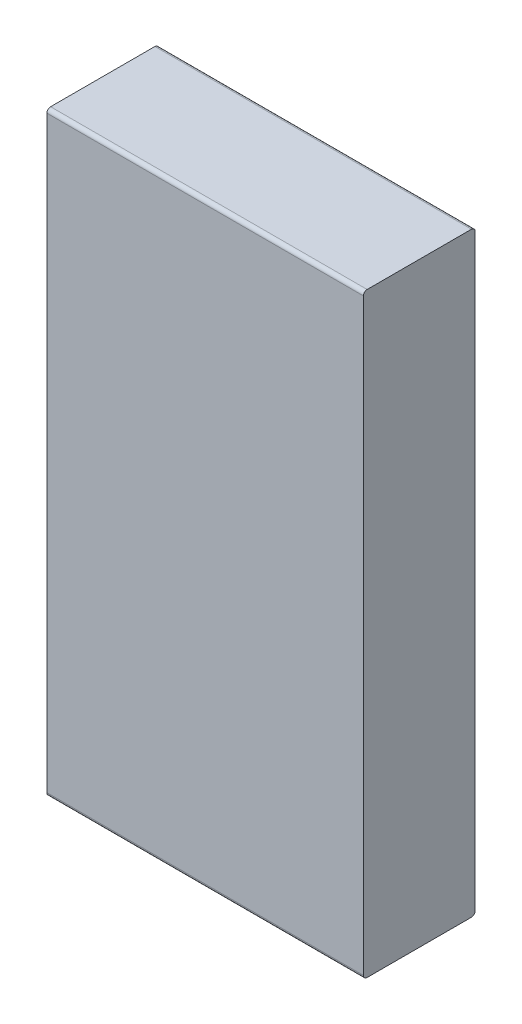
ISO-10303-21;
HEADER;
FILE_DESCRIPTION(('STEP AP214'),'2;1');
FILE_NAME('part.step','',(''),(''),'','','');
FILE_SCHEMA(('AUTOMOTIVE_DESIGN { 1 0 10303 214 1 1 1 1 }'));
ENDSEC;
DATA;
#1=APPLICATION_CONTEXT('core data for automotive mechanical design processes');
#2=APPLICATION_PROTOCOL_DEFINITION('international standard','automotive_design',2000,#1);
#3=PRODUCT_CONTEXT('',#1,'mechanical');
#4=PRODUCT('Part','Part','',(#3));
#5=PRODUCT_RELATED_PRODUCT_CATEGORY('part','',(#4));
#6=PRODUCT_DEFINITION_FORMATION('','',#4);
#7=PRODUCT_DEFINITION_CONTEXT('part definition',#1,'design');
#8=PRODUCT_DEFINITION('design','',#6,#7);
#9=PRODUCT_DEFINITION_SHAPE('','',#8);
#10=(LENGTH_UNIT() NAMED_UNIT(*) SI_UNIT(.MILLI.,.METRE.));
#11=(NAMED_UNIT(*) PLANE_ANGLE_UNIT() SI_UNIT($,.RADIAN.));
#12=(NAMED_UNIT(*) SI_UNIT($,.STERADIAN.) SOLID_ANGLE_UNIT());
#13=UNCERTAINTY_MEASURE_WITH_UNIT(LENGTH_MEASURE(1.E-05),#10,'distance_accuracy_value','');
#14=(GEOMETRIC_REPRESENTATION_CONTEXT(3) GLOBAL_UNCERTAINTY_ASSIGNED_CONTEXT((#13)) GLOBAL_UNIT_ASSIGNED_CONTEXT((#10,
#11,#12)) REPRESENTATION_CONTEXT('',''));
#15=CARTESIAN_POINT('',(0.,0.,0.));
#16=DIRECTION('',(0.,0.,1.));
#17=DIRECTION('',(1.,0.,0.));
#18=AXIS2_PLACEMENT_3D('',#15,#16,#17);
#19=CARTESIAN_POINT('',(0.425,-0.8,0.));
#20=DIRECTION('',(-1.,0.,0.));
#21=DIRECTION('',(0.,0.,1.));
#22=AXIS2_PLACEMENT_3D('',#19,#20,#21);
#23=PLANE('',#22);
#24=DIRECTION('',(0.,0.,1.));
#25=VECTOR('',#24,1.);
#26=CARTESIAN_POINT('',(0.425,-0.8,0.));
#27=LINE('',#26,#25);
#28=CARTESIAN_POINT('',(0.425,-0.8,0.01));
#29=VERTEX_POINT('',#28);
#30=CARTESIAN_POINT('',(0.425,-0.8,0.29));
#31=VERTEX_POINT('',#30);
#32=EDGE_CURVE('E11',#29,#31,#27,.T.);
#33=ORIENTED_EDGE('',*,*,#32,.F.);
#34=CARTESIAN_POINT('',(0.425,-0.79,0.01));
#35=DIRECTION('',(1.,0.,0.));
#36=DIRECTION('',(0.,0.,1.));
#37=AXIS2_PLACEMENT_3D('',#34,#35,#36);
#38=CIRCLE('',#37,0.01);
#39=CARTESIAN_POINT('',(0.425,-0.79,0.));
#40=VERTEX_POINT('',#39);
#41=EDGE_CURVE('E98',#29,#40,#38,.T.);
#42=ORIENTED_EDGE('',*,*,#41,.T.);
#43=DIRECTION('',(0.,1.,0.));
#44=VECTOR('',#43,1.);
#45=CARTESIAN_POINT('',(0.425,-0.8,0.));
#46=LINE('',#45,#44);
#47=CARTESIAN_POINT('',(0.425,0.79,0.));
#48=VERTEX_POINT('',#47);
#49=EDGE_CURVE('E101',#40,#48,#46,.T.);
#50=ORIENTED_EDGE('',*,*,#49,.T.);
#51=CARTESIAN_POINT('',(0.425,0.79,0.01));
#52=DIRECTION('',(-1.,0.,0.));
#53=DIRECTION('',(0.,0.,-1.));
#54=AXIS2_PLACEMENT_3D('',#51,#52,#53);
#55=CIRCLE('',#54,0.01);
#56=CARTESIAN_POINT('',(0.425,0.8,0.01));
#57=VERTEX_POINT('',#56);
#58=EDGE_CURVE('E154',#57,#48,#55,.T.);
#59=ORIENTED_EDGE('',*,*,#58,.F.);
#60=DIRECTION('',(0.,0.,1.));
#61=VECTOR('',#60,1.);
#62=CARTESIAN_POINT('',(0.425,0.8,0.));
#63=LINE('',#62,#61);
#64=CARTESIAN_POINT('',(0.425,0.8,0.29));
#65=VERTEX_POINT('',#64);
#66=EDGE_CURVE('E147',#57,#65,#63,.T.);
#67=ORIENTED_EDGE('',*,*,#66,.T.);
#68=CARTESIAN_POINT('',(0.425,0.79,0.29));
#69=DIRECTION('',(1.,0.,0.));
#70=DIRECTION('',(0.,0.,-1.));
#71=AXIS2_PLACEMENT_3D('',#68,#69,#70);
#72=CIRCLE('',#71,0.01);
#73=CARTESIAN_POINT('',(0.425,0.79,0.3));
#74=VERTEX_POINT('',#73);
#75=EDGE_CURVE('E129',#65,#74,#72,.T.);
#76=ORIENTED_EDGE('',*,*,#75,.T.);
#77=DIRECTION('',(0.,1.,0.));
#78=VECTOR('',#77,1.);
#79=CARTESIAN_POINT('',(0.425,-0.8,0.3));
#80=LINE('',#79,#78);
#81=CARTESIAN_POINT('',(0.425,-0.79,0.3));
#82=VERTEX_POINT('',#81);
#83=EDGE_CURVE('E106',#82,#74,#80,.T.);
#84=ORIENTED_EDGE('',*,*,#83,.F.);
#85=CARTESIAN_POINT('',(0.425,-0.79,0.29));
#86=DIRECTION('',(-1.,0.,0.));
#87=DIRECTION('',(0.,0.,1.));
#88=AXIS2_PLACEMENT_3D('',#85,#86,#87);
#89=CIRCLE('',#88,0.01);
#90=EDGE_CURVE('E26',#31,#82,#89,.T.);
#91=ORIENTED_EDGE('',*,*,#90,.F.);
#92=EDGE_LOOP('',(#33,#42,#50,#59,#67,#76,#84,#91));
#93=FACE_BOUND('',#92,.T.);
#94=ADVANCED_FACE('F17',(#93),#23,.F.);
#95=CARTESIAN_POINT('',(-0.425,-0.8,0.));
#96=DIRECTION('',(0.,1.,0.));
#97=DIRECTION('',(1.,0.,0.));
#98=AXIS2_PLACEMENT_3D('',#95,#96,#97);
#99=PLANE('',#98);
#100=DIRECTION('',(0.,0.,1.));
#101=VECTOR('',#100,1.);
#102=CARTESIAN_POINT('',(-0.425,-0.8,0.));
#103=LINE('',#102,#101);
#104=CARTESIAN_POINT('',(-0.425,-0.8,0.01));
#105=VERTEX_POINT('',#104);
#106=CARTESIAN_POINT('',(-0.425,-0.8,0.29));
#107=VERTEX_POINT('',#106);
#108=EDGE_CURVE('E135',#105,#107,#103,.T.);
#109=ORIENTED_EDGE('',*,*,#108,.F.);
#110=DIRECTION('',(1.,0.,0.));
#111=VECTOR('',#110,1.);
#112=CARTESIAN_POINT('',(-0.425,-0.8,0.01));
#113=LINE('',#112,#111);
#114=EDGE_CURVE('E105',#105,#29,#113,.T.);
#115=ORIENTED_EDGE('',*,*,#114,.T.);
#116=ORIENTED_EDGE('',*,*,#32,.T.);
#117=DIRECTION('',(1.,0.,0.));
#118=VECTOR('',#117,1.);
#119=CARTESIAN_POINT('',(-0.425,-0.8,0.29));
#120=LINE('',#119,#118);
#121=EDGE_CURVE('E170',#107,#31,#120,.T.);
#122=ORIENTED_EDGE('',*,*,#121,.F.);
#123=EDGE_LOOP('',(#109,#115,#116,#122));
#124=FACE_BOUND('',#123,.T.);
#125=ADVANCED_FACE('F209',(#124),#99,.F.);
#126=CARTESIAN_POINT('',(-0.425,-0.79,0.29));
#127=DIRECTION('',(1.,0.,0.));
#128=DIRECTION('',(0.,-1.,0.));
#129=AXIS2_PLACEMENT_3D('',#126,#127,#128);
#130=CYLINDRICAL_SURFACE('',#129,0.01);
#131=CARTESIAN_POINT('',(-0.425,-0.79,0.29));
#132=DIRECTION('',(-1.,0.,0.));
#133=DIRECTION('',(0.,0.,1.));
#134=AXIS2_PLACEMENT_3D('',#131,#132,#133);
#135=CIRCLE('',#134,0.01);
#136=CARTESIAN_POINT('',(-0.425,-0.79,0.3));
#137=VERTEX_POINT('',#136);
#138=EDGE_CURVE('E138',#107,#137,#135,.T.);
#139=ORIENTED_EDGE('',*,*,#138,.F.);
#140=ORIENTED_EDGE('',*,*,#121,.T.);
#141=ORIENTED_EDGE('',*,*,#90,.T.);
#142=DIRECTION('',(1.,0.,0.));
#143=VECTOR('',#142,1.);
#144=CARTESIAN_POINT('',(-0.425,-0.79,0.3));
#145=LINE('',#144,#143);
#146=EDGE_CURVE('E117',#137,#82,#145,.T.);
#147=ORIENTED_EDGE('',*,*,#146,.F.);
#148=EDGE_LOOP('',(#139,#140,#141,#147));
#149=FACE_BOUND('',#148,.T.);
#150=ADVANCED_FACE('F214',(#149),#130,.T.);
#151=CARTESIAN_POINT('',(-0.425,-0.79,0.01));
#152=DIRECTION('',(1.,0.,0.));
#153=DIRECTION('',(0.,-1.,0.));
#154=AXIS2_PLACEMENT_3D('',#151,#152,#153);
#155=CYLINDRICAL_SURFACE('',#154,0.01);
#156=CARTESIAN_POINT('',(-0.425,-0.79,0.01));
#157=DIRECTION('',(1.,0.,0.));
#158=DIRECTION('',(0.,0.,1.));
#159=AXIS2_PLACEMENT_3D('',#156,#157,#158);
#160=CIRCLE('',#159,0.01);
#161=CARTESIAN_POINT('',(-0.425,-0.79,0.));
#162=VERTEX_POINT('',#161);
#163=EDGE_CURVE('E112',#105,#162,#160,.T.);
#164=ORIENTED_EDGE('',*,*,#163,.T.);
#165=DIRECTION('',(1.,0.,0.));
#166=VECTOR('',#165,1.);
#167=CARTESIAN_POINT('',(-0.425,-0.79,0.));
#168=LINE('',#167,#166);
#169=EDGE_CURVE('E109',#162,#40,#168,.T.);
#170=ORIENTED_EDGE('',*,*,#169,.T.);
#171=ORIENTED_EDGE('',*,*,#41,.F.);
#172=ORIENTED_EDGE('',*,*,#114,.F.);
#173=EDGE_LOOP('',(#164,#170,#171,#172));
#174=FACE_BOUND('',#173,.T.);
#175=ADVANCED_FACE('F110',(#174),#155,.T.);
#176=CARTESIAN_POINT('',(0.,0.,0.3));
#177=DIRECTION('',(0.,0.,1.));
#178=DIRECTION('',(1.,0.,0.));
#179=AXIS2_PLACEMENT_3D('',#176,#177,#178);
#180=PLANE('',#179);
#181=DIRECTION('',(0.,-1.,0.));
#182=VECTOR('',#181,1.);
#183=CARTESIAN_POINT('',(-0.425,0.8,0.3));
#184=LINE('',#183,#182);
#185=CARTESIAN_POINT('',(-0.425,0.79,0.3));
#186=VERTEX_POINT('',#185);
#187=EDGE_CURVE('E142',#186,#137,#184,.T.);
#188=ORIENTED_EDGE('',*,*,#187,.T.);
#189=ORIENTED_EDGE('',*,*,#146,.T.);
#190=ORIENTED_EDGE('',*,*,#83,.T.);
#191=DIRECTION('',(-1.,0.,0.));
#192=VECTOR('',#191,1.);
#193=CARTESIAN_POINT('',(0.425,0.79,0.3));
#194=LINE('',#193,#192);
#195=EDGE_CURVE('E123',#74,#186,#194,.T.);
#196=ORIENTED_EDGE('',*,*,#195,.T.);
#197=EDGE_LOOP('',(#188,#189,#190,#196));
#198=FACE_BOUND('',#197,.T.);
#199=ADVANCED_FACE('F231',(#198),#180,.T.);
#200=CARTESIAN_POINT('',(0.,0.,0.));
#201=DIRECTION('',(0.,0.,1.));
#202=DIRECTION('',(1.,0.,0.));
#203=AXIS2_PLACEMENT_3D('',#200,#201,#202);
#204=PLANE('',#203);
#205=DIRECTION('',(0.,-1.,0.));
#206=VECTOR('',#205,1.);
#207=CARTESIAN_POINT('',(-0.425,0.8,0.));
#208=LINE('',#207,#206);
#209=CARTESIAN_POINT('',(-0.425,0.79,0.));
#210=VERTEX_POINT('',#209);
#211=EDGE_CURVE('E133',#210,#162,#208,.T.);
#212=ORIENTED_EDGE('',*,*,#211,.F.);
#213=DIRECTION('',(-1.,0.,0.));
#214=VECTOR('',#213,1.);
#215=CARTESIAN_POINT('',(0.425,0.79,0.));
#216=LINE('',#215,#214);
#217=EDGE_CURVE('E120',#48,#210,#216,.T.);
#218=ORIENTED_EDGE('',*,*,#217,.F.);
#219=ORIENTED_EDGE('',*,*,#49,.F.);
#220=ORIENTED_EDGE('',*,*,#169,.F.);
#221=EDGE_LOOP('',(#212,#218,#219,#220));
#222=FACE_BOUND('',#221,.T.);
#223=ADVANCED_FACE('F119',(#222),#204,.F.);
#224=CARTESIAN_POINT('',(0.425,0.79,0.29));
#225=DIRECTION('',(-1.,0.,0.));
#226=DIRECTION('',(0.,1.,0.));
#227=AXIS2_PLACEMENT_3D('',#224,#225,#226);
#228=CYLINDRICAL_SURFACE('',#227,0.01);
#229=ORIENTED_EDGE('',*,*,#75,.F.);
#230=DIRECTION('',(-1.,0.,0.));
#231=VECTOR('',#230,1.);
#232=CARTESIAN_POINT('',(0.425,0.8,0.29));
#233=LINE('',#232,#231);
#234=CARTESIAN_POINT('',(-0.425,0.8,0.29));
#235=VERTEX_POINT('',#234);
#236=EDGE_CURVE('E152',#65,#235,#233,.T.);
#237=ORIENTED_EDGE('',*,*,#236,.T.);
#238=CARTESIAN_POINT('',(-0.425,0.79,0.29));
#239=DIRECTION('',(1.,0.,0.));
#240=DIRECTION('',(0.,0.,-1.));
#241=AXIS2_PLACEMENT_3D('',#238,#239,#240);
#242=CIRCLE('',#241,0.01);
#243=EDGE_CURVE('E143',#235,#186,#242,.T.);
#244=ORIENTED_EDGE('',*,*,#243,.T.);
#245=ORIENTED_EDGE('',*,*,#195,.F.);
#246=EDGE_LOOP('',(#229,#237,#244,#245));
#247=FACE_BOUND('',#246,.T.);
#248=ADVANCED_FACE('F203',(#247),#228,.T.);
#249=CARTESIAN_POINT('',(0.425,0.79,0.01));
#250=DIRECTION('',(-1.,0.,0.));
#251=DIRECTION('',(0.,1.,0.));
#252=AXIS2_PLACEMENT_3D('',#249,#250,#251);
#253=CYLINDRICAL_SURFACE('',#252,0.01);
#254=ORIENTED_EDGE('',*,*,#58,.T.);
#255=ORIENTED_EDGE('',*,*,#217,.T.);
#256=CARTESIAN_POINT('',(-0.425,0.79,0.01));
#257=DIRECTION('',(-1.,0.,0.));
#258=DIRECTION('',(0.,0.,-1.));
#259=AXIS2_PLACEMENT_3D('',#256,#257,#258);
#260=CIRCLE('',#259,0.01);
#261=CARTESIAN_POINT('',(-0.425,0.8,0.01));
#262=VERTEX_POINT('',#261);
#263=EDGE_CURVE('E268',#262,#210,#260,.T.);
#264=ORIENTED_EDGE('',*,*,#263,.F.);
#265=DIRECTION('',(-1.,0.,0.));
#266=VECTOR('',#265,1.);
#267=CARTESIAN_POINT('',(0.425,0.8,0.01));
#268=LINE('',#267,#266);
#269=EDGE_CURVE('E151',#57,#262,#268,.T.);
#270=ORIENTED_EDGE('',*,*,#269,.F.);
#271=EDGE_LOOP('',(#254,#255,#264,#270));
#272=FACE_BOUND('',#271,.T.);
#273=ADVANCED_FACE('F194',(#272),#253,.T.);
#274=CARTESIAN_POINT('',(0.425,0.8,0.));
#275=DIRECTION('',(0.,-1.,0.));
#276=DIRECTION('',(0.,0.,-1.));
#277=AXIS2_PLACEMENT_3D('',#274,#275,#276);
#278=PLANE('',#277);
#279=ORIENTED_EDGE('',*,*,#66,.F.);
#280=ORIENTED_EDGE('',*,*,#269,.T.);
#281=DIRECTION('',(0.,0.,1.));
#282=VECTOR('',#281,1.);
#283=CARTESIAN_POINT('',(-0.425,0.8,0.));
#284=LINE('',#283,#282);
#285=EDGE_CURVE('E266',#262,#235,#284,.T.);
#286=ORIENTED_EDGE('',*,*,#285,.T.);
#287=ORIENTED_EDGE('',*,*,#236,.F.);
#288=EDGE_LOOP('',(#279,#280,#286,#287));
#289=FACE_BOUND('',#288,.T.);
#290=ADVANCED_FACE('F184',(#289),#278,.F.);
#291=CARTESIAN_POINT('',(-0.425,0.8,0.));
#292=DIRECTION('',(1.,0.,0.));
#293=DIRECTION('',(0.,1.,0.));
#294=AXIS2_PLACEMENT_3D('',#291,#292,#293);
#295=PLANE('',#294);
#296=ORIENTED_EDGE('',*,*,#285,.F.);
#297=ORIENTED_EDGE('',*,*,#263,.T.);
#298=ORIENTED_EDGE('',*,*,#211,.T.);
#299=ORIENTED_EDGE('',*,*,#163,.F.);
#300=ORIENTED_EDGE('',*,*,#108,.T.);
#301=ORIENTED_EDGE('',*,*,#138,.T.);
#302=ORIENTED_EDGE('',*,*,#187,.F.);
#303=ORIENTED_EDGE('',*,*,#243,.F.);
#304=EDGE_LOOP('',(#296,#297,#298,#299,#300,#301,#302,#303));
#305=FACE_BOUND('',#304,.T.);
#306=ADVANCED_FACE('F179',(#305),#295,.F.);
#307=CLOSED_SHELL('',(#94,#125,#150,#175,#199,#223,#248,#273,#290,#306));
#308=MANIFOLD_SOLID_BREP('B1',#307);
#309=ADVANCED_BREP_SHAPE_REPRESENTATION('',(#18,#308),#14);
#310=SHAPE_DEFINITION_REPRESENTATION(#9,#309);
ENDSEC;
END-ISO-10303-21;
